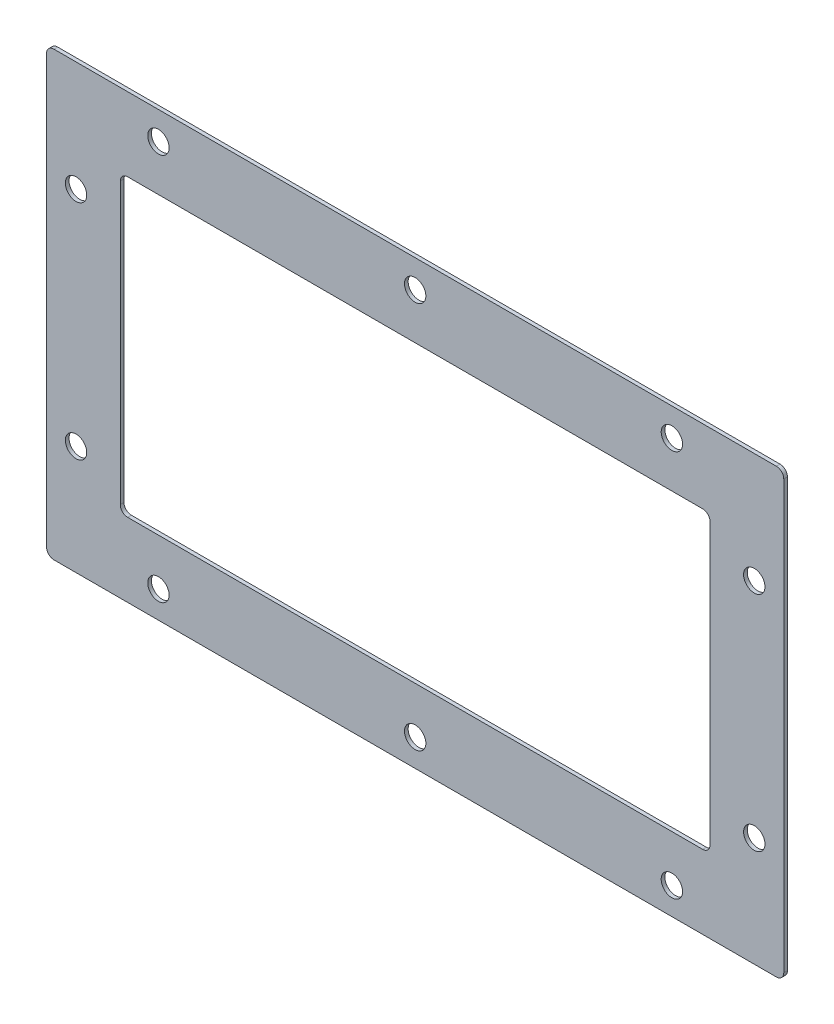
ISO-10303-21;
HEADER;
FILE_DESCRIPTION(('STEP AP214'),'2;1');
FILE_NAME('part.step','',(''),(''),'','','');
FILE_SCHEMA(('AUTOMOTIVE_DESIGN { 1 0 10303 214 1 1 1 1 }'));
ENDSEC;
DATA;
#1=APPLICATION_CONTEXT('core data for automotive mechanical design processes');
#2=APPLICATION_PROTOCOL_DEFINITION('international standard','automotive_design',2000,#1);
#3=PRODUCT_CONTEXT('',#1,'mechanical');
#4=PRODUCT('Part','Part','',(#3));
#5=PRODUCT_RELATED_PRODUCT_CATEGORY('part','',(#4));
#6=PRODUCT_DEFINITION_FORMATION('','',#4);
#7=PRODUCT_DEFINITION_CONTEXT('part definition',#1,'design');
#8=PRODUCT_DEFINITION('design','',#6,#7);
#9=PRODUCT_DEFINITION_SHAPE('','',#8);
#10=(LENGTH_UNIT() NAMED_UNIT(*) SI_UNIT(.MILLI.,.METRE.));
#11=(NAMED_UNIT(*) PLANE_ANGLE_UNIT() SI_UNIT($,.RADIAN.));
#12=(NAMED_UNIT(*) SI_UNIT($,.STERADIAN.) SOLID_ANGLE_UNIT());
#13=UNCERTAINTY_MEASURE_WITH_UNIT(LENGTH_MEASURE(1.E-05),#10,'distance_accuracy_value','');
#14=(GEOMETRIC_REPRESENTATION_CONTEXT(3) GLOBAL_UNCERTAINTY_ASSIGNED_CONTEXT((#13)) GLOBAL_UNIT_ASSIGNED_CONTEXT((#10,
#11,#12)) REPRESENTATION_CONTEXT('',''));
#15=CARTESIAN_POINT('',(0.,0.,0.));
#16=DIRECTION('',(0.,0.,1.));
#17=DIRECTION('',(1.,0.,0.));
#18=AXIS2_PLACEMENT_3D('',#15,#16,#17);
#19=CARTESIAN_POINT('',(0.,0.,1.));
#20=DIRECTION('',(0.,0.,1.));
#21=DIRECTION('',(1.,0.,0.));
#22=AXIS2_PLACEMENT_3D('',#19,#20,#21);
#23=PLANE('',#22);
#24=CARTESIAN_POINT('',(92.0000000000009,-30.3341496229136,1.));
#25=DIRECTION('',(0.,0.,1.));
#26=DIRECTION('',(1.,0.,0.));
#27=AXIS2_PLACEMENT_3D('',#24,#25,#26);
#28=CIRCLE('',#27,2.89999999999997);
#29=CARTESIAN_POINT('',(94.9000000000009,-30.3341496229136,1.));
#30=VERTEX_POINT('',#29);
#31=EDGE_CURVE('E689',#30,#30,#28,.T.);
#32=ORIENTED_EDGE('',*,*,#31,.F.);
#33=EDGE_LOOP('',(#32));
#34=FACE_BOUND('',#33,.T.);
#35=CARTESIAN_POINT('',(69.6464466094077,-52.6627726504688,1.));
#36=DIRECTION('',(0.,0.,1.));
#37=DIRECTION('',(1.,0.,0.));
#38=AXIS2_PLACEMENT_3D('',#35,#36,#37);
#39=CIRCLE('',#38,2.89999999999997);
#40=CARTESIAN_POINT('',(72.5464466094077,-52.6627726504688,1.));
#41=VERTEX_POINT('',#40);
#42=EDGE_CURVE('E683',#41,#41,#39,.T.);
#43=ORIENTED_EDGE('',*,*,#42,.F.);
#44=EDGE_LOOP('',(#43));
#45=FACE_BOUND('',#44,.T.);
#46=CARTESIAN_POINT('',(92.0000000000009,30.107073019041,1.));
#47=DIRECTION('',(0.,0.,1.));
#48=DIRECTION('',(1.,0.,0.));
#49=AXIS2_PLACEMENT_3D('',#46,#47,#48);
#50=CIRCLE('',#49,2.89999999999997);
#51=CARTESIAN_POINT('',(94.9000000000009,30.107073019041,1.));
#52=VERTEX_POINT('',#51);
#53=EDGE_CURVE('E677',#52,#52,#50,.T.);
#54=ORIENTED_EDGE('',*,*,#53,.F.);
#55=EDGE_LOOP('',(#54));
#56=FACE_BOUND('',#55,.T.);
#57=CARTESIAN_POINT('',(9.17142430958626E-13,-52.6627726504688,1.));
#58=DIRECTION('',(0.,0.,1.));
#59=DIRECTION('',(1.,0.,0.));
#60=AXIS2_PLACEMENT_3D('',#57,#58,#59);
#61=CIRCLE('',#60,2.89999999999997);
#62=CARTESIAN_POINT('',(2.90000000000089,-52.6627726504688,1.));
#63=VERTEX_POINT('',#62);
#64=EDGE_CURVE('E671',#63,#63,#61,.T.);
#65=ORIENTED_EDGE('',*,*,#64,.F.);
#66=EDGE_LOOP('',(#65));
#67=FACE_BOUND('',#66,.T.);
#68=CARTESIAN_POINT('',(69.6464466094077,52.4356960465963,1.));
#69=DIRECTION('',(0.,0.,1.));
#70=DIRECTION('',(1.,0.,0.));
#71=AXIS2_PLACEMENT_3D('',#68,#69,#70);
#72=CIRCLE('',#71,2.89999999999997);
#73=CARTESIAN_POINT('',(72.5464466094077,52.4356960465963,1.));
#74=VERTEX_POINT('',#73);
#75=EDGE_CURVE('E665',#74,#74,#72,.T.);
#76=ORIENTED_EDGE('',*,*,#75,.F.);
#77=EDGE_LOOP('',(#76));
#78=FACE_BOUND('',#77,.T.);
#79=CARTESIAN_POINT('',(9.17142430958626E-13,52.4356960465963,1.));
#80=DIRECTION('',(0.,0.,1.));
#81=DIRECTION('',(1.,0.,0.));
#82=AXIS2_PLACEMENT_3D('',#79,#80,#81);
#83=CIRCLE('',#82,2.89999999999997);
#84=CARTESIAN_POINT('',(2.90000000000089,52.4356960465963,1.));
#85=VERTEX_POINT('',#84);
#86=EDGE_CURVE('E659',#85,#85,#83,.T.);
#87=ORIENTED_EDGE('',*,*,#86,.F.);
#88=EDGE_LOOP('',(#87));
#89=FACE_BOUND('',#88,.T.);
#90=CARTESIAN_POINT('',(-69.6464466094058,52.4356960465963,1.));
#91=DIRECTION('',(0.,0.,1.));
#92=DIRECTION('',(1.,0.,0.));
#93=AXIS2_PLACEMENT_3D('',#90,#91,#92);
#94=CIRCLE('',#93,2.89999999999997);
#95=CARTESIAN_POINT('',(-66.7464466094059,52.4356960465963,1.));
#96=VERTEX_POINT('',#95);
#97=EDGE_CURVE('E653',#96,#96,#94,.T.);
#98=ORIENTED_EDGE('',*,*,#97,.F.);
#99=EDGE_LOOP('',(#98));
#100=FACE_BOUND('',#99,.T.);
#101=CARTESIAN_POINT('',(-91.9999999999991,30.107073019041,1.));
#102=DIRECTION('',(0.,0.,1.));
#103=DIRECTION('',(1.,0.,0.));
#104=AXIS2_PLACEMENT_3D('',#101,#102,#103);
#105=CIRCLE('',#104,2.89999999999997);
#106=CARTESIAN_POINT('',(-89.0999999999991,30.107073019041,1.));
#107=VERTEX_POINT('',#106);
#108=EDGE_CURVE('E647',#107,#107,#105,.T.);
#109=ORIENTED_EDGE('',*,*,#108,.F.);
#110=EDGE_LOOP('',(#109));
#111=FACE_BOUND('',#110,.T.);
#112=CARTESIAN_POINT('',(-91.9999999999991,-30.3341496229136,1.));
#113=DIRECTION('',(0.,0.,1.));
#114=DIRECTION('',(1.,0.,0.));
#115=AXIS2_PLACEMENT_3D('',#112,#113,#114);
#116=CIRCLE('',#115,2.89999999999997);
#117=CARTESIAN_POINT('',(-89.0999999999991,-30.3341496229136,1.));
#118=VERTEX_POINT('',#117);
#119=EDGE_CURVE('E641',#118,#118,#116,.T.);
#120=ORIENTED_EDGE('',*,*,#119,.F.);
#121=EDGE_LOOP('',(#120));
#122=FACE_BOUND('',#121,.T.);
#123=CARTESIAN_POINT('',(-69.6464466094058,-52.6627726504688,1.));
#124=DIRECTION('',(0.,0.,1.));
#125=DIRECTION('',(1.,0.,0.));
#126=AXIS2_PLACEMENT_3D('',#123,#124,#125);
#127=CIRCLE('',#126,2.89999999999997);
#128=CARTESIAN_POINT('',(-66.7464466094059,-52.6627726504688,1.));
#129=VERTEX_POINT('',#128);
#130=EDGE_CURVE('E635',#129,#129,#127,.T.);
#131=ORIENTED_EDGE('',*,*,#130,.F.);
#132=EDGE_LOOP('',(#131));
#133=FACE_BOUND('',#132,.T.);
#134=DIRECTION('',(-1.,0.,0.));
#135=VECTOR('',#134,1.);
#136=CARTESIAN_POINT('',(100.,60.,1.));
#137=LINE('',#136,#135);
#138=CARTESIAN_POINT('',(98.,60.,1.));
#139=VERTEX_POINT('',#138);
#140=CARTESIAN_POINT('',(-98.,60.,1.));
#141=VERTEX_POINT('',#140);
#142=EDGE_CURVE('E176',#139,#141,#137,.T.);
#143=ORIENTED_EDGE('',*,*,#142,.T.);
#144=CARTESIAN_POINT('',(-98.,58.,1.));
#145=DIRECTION('',(0.,0.,1.));
#146=DIRECTION('',(1.,0.,0.));
#147=AXIS2_PLACEMENT_3D('',#144,#145,#146);
#148=CIRCLE('',#147,2.);
#149=CARTESIAN_POINT('',(-100.,58.,1.));
#150=VERTEX_POINT('',#149);
#151=EDGE_CURVE('E223',#141,#150,#148,.T.);
#152=ORIENTED_EDGE('',*,*,#151,.T.);
#153=DIRECTION('',(0.,-1.,0.));
#154=VECTOR('',#153,1.);
#155=CARTESIAN_POINT('',(-100.,-60.,1.));
#156=LINE('',#155,#154);
#157=CARTESIAN_POINT('',(-100.,-58.,1.));
#158=VERTEX_POINT('',#157);
#159=EDGE_CURVE('E276',#150,#158,#156,.T.);
#160=ORIENTED_EDGE('',*,*,#159,.T.);
#161=CARTESIAN_POINT('',(-98.,-58.,1.));
#162=DIRECTION('',(0.,0.,1.));
#163=DIRECTION('',(1.,0.,0.));
#164=AXIS2_PLACEMENT_3D('',#161,#162,#163);
#165=CIRCLE('',#164,2.);
#166=CARTESIAN_POINT('',(-98.,-60.,1.));
#167=VERTEX_POINT('',#166);
#168=EDGE_CURVE('E220',#158,#167,#165,.T.);
#169=ORIENTED_EDGE('',*,*,#168,.T.);
#170=DIRECTION('',(1.,0.,0.));
#171=VECTOR('',#170,1.);
#172=CARTESIAN_POINT('',(100.,-60.,1.));
#173=LINE('',#172,#171);
#174=CARTESIAN_POINT('',(98.,-60.,1.));
#175=VERTEX_POINT('',#174);
#176=EDGE_CURVE('E279',#167,#175,#173,.T.);
#177=ORIENTED_EDGE('',*,*,#176,.T.);
#178=CARTESIAN_POINT('',(98.,-58.,1.));
#179=DIRECTION('',(0.,0.,1.));
#180=DIRECTION('',(1.,0.,0.));
#181=AXIS2_PLACEMENT_3D('',#178,#179,#180);
#182=CIRCLE('',#181,2.);
#183=CARTESIAN_POINT('',(100.,-58.,1.));
#184=VERTEX_POINT('',#183);
#185=EDGE_CURVE('E58',#175,#184,#182,.T.);
#186=ORIENTED_EDGE('',*,*,#185,.T.);
#187=DIRECTION('',(0.,1.,0.));
#188=VECTOR('',#187,1.);
#189=CARTESIAN_POINT('',(100.,-60.,1.));
#190=LINE('',#189,#188);
#191=CARTESIAN_POINT('',(100.,58.,1.));
#192=VERTEX_POINT('',#191);
#193=EDGE_CURVE('E181',#184,#192,#190,.T.);
#194=ORIENTED_EDGE('',*,*,#193,.T.);
#195=CARTESIAN_POINT('',(98.,58.,1.));
#196=DIRECTION('',(0.,0.,1.));
#197=DIRECTION('',(1.,0.,0.));
#198=AXIS2_PLACEMENT_3D('',#195,#196,#197);
#199=CIRCLE('',#198,2.);
#200=EDGE_CURVE('E218',#192,#139,#199,.T.);
#201=ORIENTED_EDGE('',*,*,#200,.T.);
#202=EDGE_LOOP('',(#143,#152,#160,#169,#177,#186,#194,#201));
#203=FACE_BOUND('',#202,.T.);
#204=DIRECTION('',(1.,0.,0.));
#205=VECTOR('',#204,1.);
#206=CARTESIAN_POINT('',(80.,-40.,1.));
#207=LINE('',#206,#205);
#208=CARTESIAN_POINT('',(-78.,-40.,1.));
#209=VERTEX_POINT('',#208);
#210=CARTESIAN_POINT('',(78.,-40.,1.));
#211=VERTEX_POINT('',#210);
#212=EDGE_CURVE('E266',#209,#211,#207,.T.);
#213=ORIENTED_EDGE('',*,*,#212,.F.);
#214=CARTESIAN_POINT('',(-78.,-38.,1.));
#215=DIRECTION('',(0.,0.,1.));
#216=DIRECTION('',(1.,0.,0.));
#217=AXIS2_PLACEMENT_3D('',#214,#215,#216);
#218=CIRCLE('',#217,2.);
#219=CARTESIAN_POINT('',(-80.,-38.,1.));
#220=VERTEX_POINT('',#219);
#221=EDGE_CURVE('E161',#209,#220,#218,.F.);
#222=ORIENTED_EDGE('',*,*,#221,.T.);
#223=DIRECTION('',(0.,-1.,0.));
#224=VECTOR('',#223,1.);
#225=CARTESIAN_POINT('',(-80.,-40.,1.));
#226=LINE('',#225,#224);
#227=CARTESIAN_POINT('',(-80.,38.,1.));
#228=VERTEX_POINT('',#227);
#229=EDGE_CURVE('E253',#228,#220,#226,.T.);
#230=ORIENTED_EDGE('',*,*,#229,.F.);
#231=CARTESIAN_POINT('',(-78.,38.,1.));
#232=DIRECTION('',(0.,0.,1.));
#233=DIRECTION('',(1.,0.,0.));
#234=AXIS2_PLACEMENT_3D('',#231,#232,#233);
#235=CIRCLE('',#234,2.);
#236=CARTESIAN_POINT('',(-78.,40.,1.));
#237=VERTEX_POINT('',#236);
#238=EDGE_CURVE('E162',#228,#237,#235,.F.);
#239=ORIENTED_EDGE('',*,*,#238,.T.);
#240=DIRECTION('',(-1.,0.,0.));
#241=VECTOR('',#240,1.);
#242=CARTESIAN_POINT('',(80.,40.,1.));
#243=LINE('',#242,#241);
#244=CARTESIAN_POINT('',(78.,40.,1.));
#245=VERTEX_POINT('',#244);
#246=EDGE_CURVE('E262',#245,#237,#243,.T.);
#247=ORIENTED_EDGE('',*,*,#246,.F.);
#248=CARTESIAN_POINT('',(78.,38.,1.));
#249=DIRECTION('',(0.,0.,1.));
#250=DIRECTION('',(1.,0.,0.));
#251=AXIS2_PLACEMENT_3D('',#248,#249,#250);
#252=CIRCLE('',#251,2.);
#253=CARTESIAN_POINT('',(80.,38.,1.));
#254=VERTEX_POINT('',#253);
#255=EDGE_CURVE('E11',#245,#254,#252,.F.);
#256=ORIENTED_EDGE('',*,*,#255,.T.);
#257=DIRECTION('',(0.,1.,0.));
#258=VECTOR('',#257,1.);
#259=CARTESIAN_POINT('',(80.,-40.,1.));
#260=LINE('',#259,#258);
#261=CARTESIAN_POINT('',(80.,-38.,1.));
#262=VERTEX_POINT('',#261);
#263=EDGE_CURVE('E260',#262,#254,#260,.T.);
#264=ORIENTED_EDGE('',*,*,#263,.F.);
#265=CARTESIAN_POINT('',(78.,-38.,1.));
#266=DIRECTION('',(0.,0.,1.));
#267=DIRECTION('',(1.,0.,0.));
#268=AXIS2_PLACEMENT_3D('',#265,#266,#267);
#269=CIRCLE('',#268,2.);
#270=EDGE_CURVE('E236',#262,#211,#269,.F.);
#271=ORIENTED_EDGE('',*,*,#270,.T.);
#272=EDGE_LOOP('',(#213,#222,#230,#239,#247,#256,#264,#271));
#273=FACE_BOUND('',#272,.T.);
#274=ADVANCED_FACE('F36',(#34,#45,#56,#67,#78,#89,#100,#111,#122,#133,#203,#273),#23,.T.);
#275=CARTESIAN_POINT('',(0.,0.,0.));
#276=DIRECTION('',(0.,0.,1.));
#277=DIRECTION('',(1.,0.,0.));
#278=AXIS2_PLACEMENT_3D('',#275,#276,#277);
#279=PLANE('',#278);
#280=CARTESIAN_POINT('',(92.0000000000009,-30.3341496229136,0.));
#281=DIRECTION('',(0.,0.,1.));
#282=DIRECTION('',(1.,0.,0.));
#283=AXIS2_PLACEMENT_3D('',#280,#281,#282);
#284=CIRCLE('',#283,2.89999999999997);
#285=CARTESIAN_POINT('',(94.9000000000009,-30.3341496229136,0.));
#286=VERTEX_POINT('',#285);
#287=EDGE_CURVE('E686',#286,#286,#284,.T.);
#288=ORIENTED_EDGE('',*,*,#287,.T.);
#289=EDGE_LOOP('',(#288));
#290=FACE_BOUND('',#289,.T.);
#291=CARTESIAN_POINT('',(69.6464466094077,-52.6627726504688,0.));
#292=DIRECTION('',(0.,0.,1.));
#293=DIRECTION('',(1.,0.,0.));
#294=AXIS2_PLACEMENT_3D('',#291,#292,#293);
#295=CIRCLE('',#294,2.89999999999997);
#296=CARTESIAN_POINT('',(72.5464466094077,-52.6627726504688,0.));
#297=VERTEX_POINT('',#296);
#298=EDGE_CURVE('E680',#297,#297,#295,.T.);
#299=ORIENTED_EDGE('',*,*,#298,.T.);
#300=EDGE_LOOP('',(#299));
#301=FACE_BOUND('',#300,.T.);
#302=CARTESIAN_POINT('',(92.0000000000009,30.107073019041,0.));
#303=DIRECTION('',(0.,0.,1.));
#304=DIRECTION('',(1.,0.,0.));
#305=AXIS2_PLACEMENT_3D('',#302,#303,#304);
#306=CIRCLE('',#305,2.89999999999997);
#307=CARTESIAN_POINT('',(94.9000000000009,30.107073019041,0.));
#308=VERTEX_POINT('',#307);
#309=EDGE_CURVE('E674',#308,#308,#306,.T.);
#310=ORIENTED_EDGE('',*,*,#309,.T.);
#311=EDGE_LOOP('',(#310));
#312=FACE_BOUND('',#311,.T.);
#313=CARTESIAN_POINT('',(9.17142430958626E-13,-52.6627726504688,0.));
#314=DIRECTION('',(0.,0.,1.));
#315=DIRECTION('',(1.,0.,0.));
#316=AXIS2_PLACEMENT_3D('',#313,#314,#315);
#317=CIRCLE('',#316,2.89999999999997);
#318=CARTESIAN_POINT('',(2.90000000000089,-52.6627726504688,0.));
#319=VERTEX_POINT('',#318);
#320=EDGE_CURVE('E668',#319,#319,#317,.T.);
#321=ORIENTED_EDGE('',*,*,#320,.T.);
#322=EDGE_LOOP('',(#321));
#323=FACE_BOUND('',#322,.T.);
#324=CARTESIAN_POINT('',(69.6464466094077,52.4356960465963,0.));
#325=DIRECTION('',(0.,0.,1.));
#326=DIRECTION('',(1.,0.,0.));
#327=AXIS2_PLACEMENT_3D('',#324,#325,#326);
#328=CIRCLE('',#327,2.89999999999997);
#329=CARTESIAN_POINT('',(72.5464466094077,52.4356960465963,0.));
#330=VERTEX_POINT('',#329);
#331=EDGE_CURVE('E662',#330,#330,#328,.T.);
#332=ORIENTED_EDGE('',*,*,#331,.T.);
#333=EDGE_LOOP('',(#332));
#334=FACE_BOUND('',#333,.T.);
#335=CARTESIAN_POINT('',(9.17142430958626E-13,52.4356960465963,0.));
#336=DIRECTION('',(0.,0.,1.));
#337=DIRECTION('',(1.,0.,0.));
#338=AXIS2_PLACEMENT_3D('',#335,#336,#337);
#339=CIRCLE('',#338,2.89999999999997);
#340=CARTESIAN_POINT('',(2.90000000000089,52.4356960465963,0.));
#341=VERTEX_POINT('',#340);
#342=EDGE_CURVE('E656',#341,#341,#339,.T.);
#343=ORIENTED_EDGE('',*,*,#342,.T.);
#344=EDGE_LOOP('',(#343));
#345=FACE_BOUND('',#344,.T.);
#346=CARTESIAN_POINT('',(-69.6464466094058,52.4356960465963,0.));
#347=DIRECTION('',(0.,0.,1.));
#348=DIRECTION('',(1.,0.,0.));
#349=AXIS2_PLACEMENT_3D('',#346,#347,#348);
#350=CIRCLE('',#349,2.89999999999997);
#351=CARTESIAN_POINT('',(-66.7464466094059,52.4356960465963,0.));
#352=VERTEX_POINT('',#351);
#353=EDGE_CURVE('E650',#352,#352,#350,.T.);
#354=ORIENTED_EDGE('',*,*,#353,.T.);
#355=EDGE_LOOP('',(#354));
#356=FACE_BOUND('',#355,.T.);
#357=CARTESIAN_POINT('',(-91.9999999999991,30.107073019041,0.));
#358=DIRECTION('',(0.,0.,1.));
#359=DIRECTION('',(1.,0.,0.));
#360=AXIS2_PLACEMENT_3D('',#357,#358,#359);
#361=CIRCLE('',#360,2.89999999999997);
#362=CARTESIAN_POINT('',(-89.0999999999991,30.107073019041,0.));
#363=VERTEX_POINT('',#362);
#364=EDGE_CURVE('E644',#363,#363,#361,.T.);
#365=ORIENTED_EDGE('',*,*,#364,.T.);
#366=EDGE_LOOP('',(#365));
#367=FACE_BOUND('',#366,.T.);
#368=CARTESIAN_POINT('',(-91.9999999999991,-30.3341496229136,0.));
#369=DIRECTION('',(0.,0.,1.));
#370=DIRECTION('',(1.,0.,0.));
#371=AXIS2_PLACEMENT_3D('',#368,#369,#370);
#372=CIRCLE('',#371,2.89999999999997);
#373=CARTESIAN_POINT('',(-89.0999999999991,-30.3341496229136,0.));
#374=VERTEX_POINT('',#373);
#375=EDGE_CURVE('E638',#374,#374,#372,.T.);
#376=ORIENTED_EDGE('',*,*,#375,.T.);
#377=EDGE_LOOP('',(#376));
#378=FACE_BOUND('',#377,.T.);
#379=CARTESIAN_POINT('',(-69.6464466094058,-52.6627726504688,0.));
#380=DIRECTION('',(0.,0.,1.));
#381=DIRECTION('',(1.,0.,0.));
#382=AXIS2_PLACEMENT_3D('',#379,#380,#381);
#383=CIRCLE('',#382,2.89999999999997);
#384=CARTESIAN_POINT('',(-66.7464466094059,-52.6627726504688,0.));
#385=VERTEX_POINT('',#384);
#386=EDGE_CURVE('E273',#385,#385,#383,.T.);
#387=ORIENTED_EDGE('',*,*,#386,.T.);
#388=EDGE_LOOP('',(#387));
#389=FACE_BOUND('',#388,.T.);
#390=DIRECTION('',(0.,-1.,0.));
#391=VECTOR('',#390,1.);
#392=CARTESIAN_POINT('',(-100.,-60.,0.));
#393=LINE('',#392,#391);
#394=CARTESIAN_POINT('',(-100.,58.,0.));
#395=VERTEX_POINT('',#394);
#396=CARTESIAN_POINT('',(-100.,-58.,0.));
#397=VERTEX_POINT('',#396);
#398=EDGE_CURVE('E268',#395,#397,#393,.T.);
#399=ORIENTED_EDGE('',*,*,#398,.F.);
#400=CARTESIAN_POINT('',(-98.,58.,0.));
#401=DIRECTION('',(0.,0.,1.));
#402=DIRECTION('',(1.,0.,0.));
#403=AXIS2_PLACEMENT_3D('',#400,#401,#402);
#404=CIRCLE('',#403,2.);
#405=CARTESIAN_POINT('',(-98.,60.,0.));
#406=VERTEX_POINT('',#405);
#407=EDGE_CURVE('E211',#395,#406,#404,.F.);
#408=ORIENTED_EDGE('',*,*,#407,.T.);
#409=DIRECTION('',(-1.,0.,0.));
#410=VECTOR('',#409,1.);
#411=CARTESIAN_POINT('',(100.,60.,0.));
#412=LINE('',#411,#410);
#413=CARTESIAN_POINT('',(98.,60.,0.));
#414=VERTEX_POINT('',#413);
#415=EDGE_CURVE('E184',#414,#406,#412,.T.);
#416=ORIENTED_EDGE('',*,*,#415,.F.);
#417=CARTESIAN_POINT('',(98.,58.,0.));
#418=DIRECTION('',(0.,0.,1.));
#419=DIRECTION('',(1.,0.,0.));
#420=AXIS2_PLACEMENT_3D('',#417,#418,#419);
#421=CIRCLE('',#420,2.);
#422=CARTESIAN_POINT('',(100.,58.,0.));
#423=VERTEX_POINT('',#422);
#424=EDGE_CURVE('E205',#414,#423,#421,.F.);
#425=ORIENTED_EDGE('',*,*,#424,.T.);
#426=DIRECTION('',(0.,1.,0.));
#427=VECTOR('',#426,1.);
#428=CARTESIAN_POINT('',(100.,-60.,0.));
#429=LINE('',#428,#427);
#430=CARTESIAN_POINT('',(100.,-58.,0.));
#431=VERTEX_POINT('',#430);
#432=EDGE_CURVE('E286',#431,#423,#429,.T.);
#433=ORIENTED_EDGE('',*,*,#432,.F.);
#434=CARTESIAN_POINT('',(98.,-58.,0.));
#435=DIRECTION('',(0.,0.,1.));
#436=DIRECTION('',(1.,0.,0.));
#437=AXIS2_PLACEMENT_3D('',#434,#435,#436);
#438=CIRCLE('',#437,2.);
#439=CARTESIAN_POINT('',(98.,-60.,0.));
#440=VERTEX_POINT('',#439);
#441=EDGE_CURVE('E209',#431,#440,#438,.F.);
#442=ORIENTED_EDGE('',*,*,#441,.T.);
#443=DIRECTION('',(1.,0.,0.));
#444=VECTOR('',#443,1.);
#445=CARTESIAN_POINT('',(100.,-60.,0.));
#446=LINE('',#445,#444);
#447=CARTESIAN_POINT('',(-98.,-60.,0.));
#448=VERTEX_POINT('',#447);
#449=EDGE_CURVE('E284',#448,#440,#446,.T.);
#450=ORIENTED_EDGE('',*,*,#449,.F.);
#451=CARTESIAN_POINT('',(-98.,-58.,0.));
#452=DIRECTION('',(0.,0.,1.));
#453=DIRECTION('',(1.,0.,0.));
#454=AXIS2_PLACEMENT_3D('',#451,#452,#453);
#455=CIRCLE('',#454,2.);
#456=EDGE_CURVE('E207',#448,#397,#455,.F.);
#457=ORIENTED_EDGE('',*,*,#456,.T.);
#458=EDGE_LOOP('',(#399,#408,#416,#425,#433,#442,#450,#457));
#459=FACE_BOUND('',#458,.T.);
#460=DIRECTION('',(-1.,0.,0.));
#461=VECTOR('',#460,1.);
#462=CARTESIAN_POINT('',(80.,40.,0.));
#463=LINE('',#462,#461);
#464=CARTESIAN_POINT('',(78.,40.,0.));
#465=VERTEX_POINT('',#464);
#466=CARTESIAN_POINT('',(-78.,40.,0.));
#467=VERTEX_POINT('',#466);
#468=EDGE_CURVE('E243',#465,#467,#463,.T.);
#469=ORIENTED_EDGE('',*,*,#468,.T.);
#470=CARTESIAN_POINT('',(-78.,38.,0.));
#471=DIRECTION('',(0.,0.,1.));
#472=DIRECTION('',(1.,0.,0.));
#473=AXIS2_PLACEMENT_3D('',#470,#471,#472);
#474=CIRCLE('',#473,2.);
#475=CARTESIAN_POINT('',(-80.,38.,0.));
#476=VERTEX_POINT('',#475);
#477=EDGE_CURVE('E238',#467,#476,#474,.T.);
#478=ORIENTED_EDGE('',*,*,#477,.T.);
#479=DIRECTION('',(0.,-1.,0.));
#480=VECTOR('',#479,1.);
#481=CARTESIAN_POINT('',(-80.,-40.,0.));
#482=LINE('',#481,#480);
#483=CARTESIAN_POINT('',(-80.,-38.,0.));
#484=VERTEX_POINT('',#483);
#485=EDGE_CURVE('E156',#476,#484,#482,.T.);
#486=ORIENTED_EDGE('',*,*,#485,.T.);
#487=CARTESIAN_POINT('',(-78.,-38.,0.));
#488=DIRECTION('',(0.,0.,1.));
#489=DIRECTION('',(1.,0.,0.));
#490=AXIS2_PLACEMENT_3D('',#487,#488,#489);
#491=CIRCLE('',#490,2.);
#492=CARTESIAN_POINT('',(-78.,-40.,0.));
#493=VERTEX_POINT('',#492);
#494=EDGE_CURVE('E150',#484,#493,#491,.T.);
#495=ORIENTED_EDGE('',*,*,#494,.T.);
#496=DIRECTION('',(1.,0.,0.));
#497=VECTOR('',#496,1.);
#498=CARTESIAN_POINT('',(80.,-40.,0.));
#499=LINE('',#498,#497);
#500=CARTESIAN_POINT('',(78.,-40.,0.));
#501=VERTEX_POINT('',#500);
#502=EDGE_CURVE('E154',#493,#501,#499,.T.);
#503=ORIENTED_EDGE('',*,*,#502,.T.);
#504=CARTESIAN_POINT('',(78.,-38.,0.));
#505=DIRECTION('',(0.,0.,1.));
#506=DIRECTION('',(1.,0.,0.));
#507=AXIS2_PLACEMENT_3D('',#504,#505,#506);
#508=CIRCLE('',#507,2.);
#509=CARTESIAN_POINT('',(80.,-38.,0.));
#510=VERTEX_POINT('',#509);
#511=EDGE_CURVE('E234',#501,#510,#508,.T.);
#512=ORIENTED_EDGE('',*,*,#511,.T.);
#513=DIRECTION('',(0.,1.,0.));
#514=VECTOR('',#513,1.);
#515=CARTESIAN_POINT('',(80.,-40.,0.));
#516=LINE('',#515,#514);
#517=CARTESIAN_POINT('',(80.,38.,0.));
#518=VERTEX_POINT('',#517);
#519=EDGE_CURVE('E172',#510,#518,#516,.T.);
#520=ORIENTED_EDGE('',*,*,#519,.T.);
#521=CARTESIAN_POINT('',(78.,38.,0.));
#522=DIRECTION('',(0.,0.,1.));
#523=DIRECTION('',(1.,0.,0.));
#524=AXIS2_PLACEMENT_3D('',#521,#522,#523);
#525=CIRCLE('',#524,2.);
#526=EDGE_CURVE('E44',#518,#465,#525,.T.);
#527=ORIENTED_EDGE('',*,*,#526,.T.);
#528=EDGE_LOOP('',(#469,#478,#486,#495,#503,#512,#520,#527));
#529=FACE_BOUND('',#528,.T.);
#530=ADVANCED_FACE('F153',(#290,#301,#312,#323,#334,#345,#356,#367,#378,#389,#459,#529),#279,.F.);
#531=CARTESIAN_POINT('',(-100.,-60.,1.));
#532=DIRECTION('',(1.,0.,0.));
#533=DIRECTION('',(0.,1.,0.));
#534=AXIS2_PLACEMENT_3D('',#531,#532,#533);
#535=PLANE('',#534);
#536=ORIENTED_EDGE('',*,*,#159,.F.);
#537=DIRECTION('',(0.,0.,-1.));
#538=VECTOR('',#537,1.);
#539=CARTESIAN_POINT('',(-100.,58.,1.));
#540=LINE('',#539,#538);
#541=EDGE_CURVE('E202',#150,#395,#540,.T.);
#542=ORIENTED_EDGE('',*,*,#541,.T.);
#543=ORIENTED_EDGE('',*,*,#398,.T.);
#544=DIRECTION('',(0.,0.,-1.));
#545=VECTOR('',#544,1.);
#546=CARTESIAN_POINT('',(-100.,-58.,1.));
#547=LINE('',#546,#545);
#548=EDGE_CURVE('E200',#397,#158,#547,.F.);
#549=ORIENTED_EDGE('',*,*,#548,.T.);
#550=EDGE_LOOP('',(#536,#542,#543,#549));
#551=FACE_BOUND('',#550,.T.);
#552=ADVANCED_FACE('F303',(#551),#535,.F.);
#553=CARTESIAN_POINT('',(100.,-60.,1.));
#554=DIRECTION('',(0.,1.,0.));
#555=DIRECTION('',(-1.,0.,0.));
#556=AXIS2_PLACEMENT_3D('',#553,#554,#555);
#557=PLANE('',#556);
#558=ORIENTED_EDGE('',*,*,#449,.T.);
#559=DIRECTION('',(0.,0.,-1.));
#560=VECTOR('',#559,1.);
#561=CARTESIAN_POINT('',(98.,-60.,1.));
#562=LINE('',#561,#560);
#563=EDGE_CURVE('E232',#440,#175,#562,.F.);
#564=ORIENTED_EDGE('',*,*,#563,.T.);
#565=ORIENTED_EDGE('',*,*,#176,.F.);
#566=DIRECTION('',(0.,0.,-1.));
#567=VECTOR('',#566,1.);
#568=CARTESIAN_POINT('',(-98.,-60.,1.));
#569=LINE('',#568,#567);
#570=EDGE_CURVE('E229',#167,#448,#569,.T.);
#571=ORIENTED_EDGE('',*,*,#570,.T.);
#572=EDGE_LOOP('',(#558,#564,#565,#571));
#573=FACE_BOUND('',#572,.T.);
#574=ADVANCED_FACE('F311',(#573),#557,.F.);
#575=CARTESIAN_POINT('',(100.,-60.,1.));
#576=DIRECTION('',(-1.,0.,0.));
#577=DIRECTION('',(0.,0.,1.));
#578=AXIS2_PLACEMENT_3D('',#575,#576,#577);
#579=PLANE('',#578);
#580=ORIENTED_EDGE('',*,*,#193,.F.);
#581=DIRECTION('',(0.,0.,-1.));
#582=VECTOR('',#581,1.);
#583=CARTESIAN_POINT('',(100.,-58.,1.));
#584=LINE('',#583,#582);
#585=EDGE_CURVE('E226',#184,#431,#584,.T.);
#586=ORIENTED_EDGE('',*,*,#585,.T.);
#587=ORIENTED_EDGE('',*,*,#432,.T.);
#588=DIRECTION('',(0.,0.,-1.));
#589=VECTOR('',#588,1.);
#590=CARTESIAN_POINT('',(100.,58.,1.));
#591=LINE('',#590,#589);
#592=EDGE_CURVE('E51',#423,#192,#591,.F.);
#593=ORIENTED_EDGE('',*,*,#592,.T.);
#594=EDGE_LOOP('',(#580,#586,#587,#593));
#595=FACE_BOUND('',#594,.T.);
#596=ADVANCED_FACE('F317',(#595),#579,.F.);
#597=CARTESIAN_POINT('',(100.,60.,1.));
#598=DIRECTION('',(0.,-1.,0.));
#599=DIRECTION('',(1.,0.,0.));
#600=AXIS2_PLACEMENT_3D('',#597,#598,#599);
#601=PLANE('',#600);
#602=ORIENTED_EDGE('',*,*,#415,.T.);
#603=DIRECTION('',(0.,0.,-1.));
#604=VECTOR('',#603,1.);
#605=CARTESIAN_POINT('',(-98.,60.,1.));
#606=LINE('',#605,#604);
#607=EDGE_CURVE('E216',#406,#141,#606,.F.);
#608=ORIENTED_EDGE('',*,*,#607,.T.);
#609=ORIENTED_EDGE('',*,*,#142,.F.);
#610=DIRECTION('',(0.,0.,-1.));
#611=VECTOR('',#610,1.);
#612=CARTESIAN_POINT('',(98.,60.,1.));
#613=LINE('',#612,#611);
#614=EDGE_CURVE('E213',#139,#414,#613,.T.);
#615=ORIENTED_EDGE('',*,*,#614,.T.);
#616=EDGE_LOOP('',(#602,#608,#609,#615));
#617=FACE_BOUND('',#616,.T.);
#618=ADVANCED_FACE('F292',(#617),#601,.F.);
#619=CARTESIAN_POINT('',(-80.,-40.,1.));
#620=DIRECTION('',(1.,0.,0.));
#621=DIRECTION('',(0.,0.,-1.));
#622=AXIS2_PLACEMENT_3D('',#619,#620,#621);
#623=PLANE('',#622);
#624=ORIENTED_EDGE('',*,*,#485,.F.);
#625=DIRECTION('',(0.,0.,-1.));
#626=VECTOR('',#625,1.);
#627=CARTESIAN_POINT('',(-80.,38.,1.));
#628=LINE('',#627,#626);
#629=EDGE_CURVE('E198',#476,#228,#628,.F.);
#630=ORIENTED_EDGE('',*,*,#629,.T.);
#631=ORIENTED_EDGE('',*,*,#229,.T.);
#632=DIRECTION('',(0.,0.,-1.));
#633=VECTOR('',#632,1.);
#634=CARTESIAN_POINT('',(-80.,-38.,0.));
#635=LINE('',#634,#633);
#636=EDGE_CURVE('E196',#220,#484,#635,.T.);
#637=ORIENTED_EDGE('',*,*,#636,.T.);
#638=EDGE_LOOP('',(#624,#630,#631,#637));
#639=FACE_BOUND('',#638,.T.);
#640=ADVANCED_FACE('F340',(#639),#623,.T.);
#641=CARTESIAN_POINT('',(80.,-40.,1.));
#642=DIRECTION('',(0.,1.,0.));
#643=DIRECTION('',(0.,0.,1.));
#644=AXIS2_PLACEMENT_3D('',#641,#642,#643);
#645=PLANE('',#644);
#646=ORIENTED_EDGE('',*,*,#212,.T.);
#647=DIRECTION('',(0.,0.,-1.));
#648=VECTOR('',#647,1.);
#649=CARTESIAN_POINT('',(78.,-40.,0.));
#650=LINE('',#649,#648);
#651=EDGE_CURVE('E171',#211,#501,#650,.T.);
#652=ORIENTED_EDGE('',*,*,#651,.T.);
#653=ORIENTED_EDGE('',*,*,#502,.F.);
#654=DIRECTION('',(0.,0.,-1.));
#655=VECTOR('',#654,1.);
#656=CARTESIAN_POINT('',(-78.,-40.,1.));
#657=LINE('',#656,#655);
#658=EDGE_CURVE('E168',#493,#209,#657,.F.);
#659=ORIENTED_EDGE('',*,*,#658,.T.);
#660=EDGE_LOOP('',(#646,#652,#653,#659));
#661=FACE_BOUND('',#660,.T.);
#662=ADVANCED_FACE('F167',(#661),#645,.T.);
#663=CARTESIAN_POINT('',(80.,-40.,1.));
#664=DIRECTION('',(-1.,0.,0.));
#665=DIRECTION('',(0.,0.,1.));
#666=AXIS2_PLACEMENT_3D('',#663,#664,#665);
#667=PLANE('',#666);
#668=ORIENTED_EDGE('',*,*,#519,.F.);
#669=DIRECTION('',(0.,0.,-1.));
#670=VECTOR('',#669,1.);
#671=CARTESIAN_POINT('',(80.,-38.,1.));
#672=LINE('',#671,#670);
#673=EDGE_CURVE('E189',#510,#262,#672,.F.);
#674=ORIENTED_EDGE('',*,*,#673,.T.);
#675=ORIENTED_EDGE('',*,*,#263,.T.);
#676=DIRECTION('',(0.,0.,-1.));
#677=VECTOR('',#676,1.);
#678=CARTESIAN_POINT('',(80.,38.,0.));
#679=LINE('',#678,#677);
#680=EDGE_CURVE('E178',#254,#518,#679,.T.);
#681=ORIENTED_EDGE('',*,*,#680,.T.);
#682=EDGE_LOOP('',(#668,#674,#675,#681));
#683=FACE_BOUND('',#682,.T.);
#684=ADVANCED_FACE('F264',(#683),#667,.T.);
#685=CARTESIAN_POINT('',(80.,40.,1.));
#686=DIRECTION('',(0.,-1.,0.));
#687=DIRECTION('',(1.,0.,0.));
#688=AXIS2_PLACEMENT_3D('',#685,#686,#687);
#689=PLANE('',#688);
#690=ORIENTED_EDGE('',*,*,#246,.T.);
#691=DIRECTION('',(0.,0.,-1.));
#692=VECTOR('',#691,1.);
#693=CARTESIAN_POINT('',(-78.,40.,0.));
#694=LINE('',#693,#692);
#695=EDGE_CURVE('E193',#237,#467,#694,.T.);
#696=ORIENTED_EDGE('',*,*,#695,.T.);
#697=ORIENTED_EDGE('',*,*,#468,.F.);
#698=DIRECTION('',(0.,0.,-1.));
#699=VECTOR('',#698,1.);
#700=CARTESIAN_POINT('',(78.,40.,1.));
#701=LINE('',#700,#699);
#702=EDGE_CURVE('E191',#465,#245,#701,.F.);
#703=ORIENTED_EDGE('',*,*,#702,.T.);
#704=EDGE_LOOP('',(#690,#696,#697,#703));
#705=FACE_BOUND('',#704,.T.);
#706=ADVANCED_FACE('F250',(#705),#689,.T.);
#707=CARTESIAN_POINT('',(78.,-38.,1.));
#708=DIRECTION('',(0.,0.,1.));
#709=DIRECTION('',(1.,0.,0.));
#710=AXIS2_PLACEMENT_3D('',#707,#708,#709);
#711=CYLINDRICAL_SURFACE('',#710,2.);
#712=ORIENTED_EDGE('',*,*,#270,.F.);
#713=ORIENTED_EDGE('',*,*,#673,.F.);
#714=ORIENTED_EDGE('',*,*,#511,.F.);
#715=ORIENTED_EDGE('',*,*,#651,.F.);
#716=EDGE_LOOP('',(#712,#713,#714,#715));
#717=FACE_BOUND('',#716,.T.);
#718=ADVANCED_FACE('F351',(#717),#711,.F.);
#719=CARTESIAN_POINT('',(-78.,38.,1.));
#720=DIRECTION('',(0.,0.,1.));
#721=DIRECTION('',(1.,0.,0.));
#722=AXIS2_PLACEMENT_3D('',#719,#720,#721);
#723=CYLINDRICAL_SURFACE('',#722,2.);
#724=ORIENTED_EDGE('',*,*,#238,.F.);
#725=ORIENTED_EDGE('',*,*,#629,.F.);
#726=ORIENTED_EDGE('',*,*,#477,.F.);
#727=ORIENTED_EDGE('',*,*,#695,.F.);
#728=EDGE_LOOP('',(#724,#725,#726,#727));
#729=FACE_BOUND('',#728,.T.);
#730=ADVANCED_FACE('F354',(#729),#723,.F.);
#731=CARTESIAN_POINT('',(-78.,-38.,1.));
#732=DIRECTION('',(0.,0.,1.));
#733=DIRECTION('',(1.,0.,0.));
#734=AXIS2_PLACEMENT_3D('',#731,#732,#733);
#735=CYLINDRICAL_SURFACE('',#734,2.);
#736=ORIENTED_EDGE('',*,*,#221,.F.);
#737=ORIENTED_EDGE('',*,*,#658,.F.);
#738=ORIENTED_EDGE('',*,*,#494,.F.);
#739=ORIENTED_EDGE('',*,*,#636,.F.);
#740=EDGE_LOOP('',(#736,#737,#738,#739));
#741=FACE_BOUND('',#740,.T.);
#742=ADVANCED_FACE('F175',(#741),#735,.F.);
#743=CARTESIAN_POINT('',(78.,38.,1.));
#744=DIRECTION('',(0.,0.,1.));
#745=DIRECTION('',(1.,0.,0.));
#746=AXIS2_PLACEMENT_3D('',#743,#744,#745);
#747=CYLINDRICAL_SURFACE('',#746,2.);
#748=ORIENTED_EDGE('',*,*,#255,.F.);
#749=ORIENTED_EDGE('',*,*,#702,.F.);
#750=ORIENTED_EDGE('',*,*,#526,.F.);
#751=ORIENTED_EDGE('',*,*,#680,.F.);
#752=EDGE_LOOP('',(#748,#749,#750,#751));
#753=FACE_BOUND('',#752,.T.);
#754=ADVANCED_FACE('F256',(#753),#747,.F.);
#755=CARTESIAN_POINT('',(-98.,58.,1.));
#756=DIRECTION('',(0.,0.,-1.));
#757=DIRECTION('',(-1.,0.,0.));
#758=AXIS2_PLACEMENT_3D('',#755,#756,#757);
#759=CYLINDRICAL_SURFACE('',#758,2.);
#760=ORIENTED_EDGE('',*,*,#151,.F.);
#761=ORIENTED_EDGE('',*,*,#607,.F.);
#762=ORIENTED_EDGE('',*,*,#407,.F.);
#763=ORIENTED_EDGE('',*,*,#541,.F.);
#764=EDGE_LOOP('',(#760,#761,#762,#763));
#765=FACE_BOUND('',#764,.T.);
#766=ADVANCED_FACE('F298',(#765),#759,.T.);
#767=CARTESIAN_POINT('',(98.,-58.,1.));
#768=DIRECTION('',(0.,0.,-1.));
#769=DIRECTION('',(-1.,0.,0.));
#770=AXIS2_PLACEMENT_3D('',#767,#768,#769);
#771=CYLINDRICAL_SURFACE('',#770,2.);
#772=ORIENTED_EDGE('',*,*,#185,.F.);
#773=ORIENTED_EDGE('',*,*,#563,.F.);
#774=ORIENTED_EDGE('',*,*,#441,.F.);
#775=ORIENTED_EDGE('',*,*,#585,.F.);
#776=EDGE_LOOP('',(#772,#773,#774,#775));
#777=FACE_BOUND('',#776,.T.);
#778=ADVANCED_FACE('F315',(#777),#771,.T.);
#779=CARTESIAN_POINT('',(-98.,-58.,1.));
#780=DIRECTION('',(0.,0.,-1.));
#781=DIRECTION('',(-1.,0.,0.));
#782=AXIS2_PLACEMENT_3D('',#779,#780,#781);
#783=CYLINDRICAL_SURFACE('',#782,2.);
#784=ORIENTED_EDGE('',*,*,#168,.F.);
#785=ORIENTED_EDGE('',*,*,#548,.F.);
#786=ORIENTED_EDGE('',*,*,#456,.F.);
#787=ORIENTED_EDGE('',*,*,#570,.F.);
#788=EDGE_LOOP('',(#784,#785,#786,#787));
#789=FACE_BOUND('',#788,.T.);
#790=ADVANCED_FACE('F307',(#789),#783,.T.);
#791=CARTESIAN_POINT('',(98.,58.,1.));
#792=DIRECTION('',(0.,0.,-1.));
#793=DIRECTION('',(-1.,0.,0.));
#794=AXIS2_PLACEMENT_3D('',#791,#792,#793);
#795=CYLINDRICAL_SURFACE('',#794,2.);
#796=ORIENTED_EDGE('',*,*,#200,.F.);
#797=ORIENTED_EDGE('',*,*,#592,.F.);
#798=ORIENTED_EDGE('',*,*,#424,.F.);
#799=ORIENTED_EDGE('',*,*,#614,.F.);
#800=EDGE_LOOP('',(#796,#797,#798,#799));
#801=FACE_BOUND('',#800,.T.);
#802=ADVANCED_FACE('F38',(#801),#795,.T.);
#803=CARTESIAN_POINT('',(-69.6464466094058,-52.6627726504688,1.));
#804=DIRECTION('',(0.,0.,1.));
#805=DIRECTION('',(1.,0.,0.));
#806=AXIS2_PLACEMENT_3D('',#803,#804,#805);
#807=CYLINDRICAL_SURFACE('',#806,2.89999999999997);
#808=ORIENTED_EDGE('',*,*,#386,.F.);
#809=EDGE_LOOP('',(#808));
#810=FACE_BOUND('',#809,.T.);
#811=ORIENTED_EDGE('',*,*,#130,.T.);
#812=EDGE_LOOP('',(#811));
#813=FACE_BOUND('',#812,.T.);
#814=ADVANCED_FACE('F321',(#810,#813),#807,.F.);
#815=CARTESIAN_POINT('',(-91.9999999999991,-30.3341496229136,1.));
#816=DIRECTION('',(0.,0.,1.));
#817=DIRECTION('',(1.,0.,0.));
#818=AXIS2_PLACEMENT_3D('',#815,#816,#817);
#819=CYLINDRICAL_SURFACE('',#818,2.89999999999997);
#820=ORIENTED_EDGE('',*,*,#375,.F.);
#821=EDGE_LOOP('',(#820));
#822=FACE_BOUND('',#821,.T.);
#823=ORIENTED_EDGE('',*,*,#119,.T.);
#824=EDGE_LOOP('',(#823));
#825=FACE_BOUND('',#824,.T.);
#826=ADVANCED_FACE('F326',(#822,#825),#819,.F.);
#827=CARTESIAN_POINT('',(-91.9999999999991,30.107073019041,1.));
#828=DIRECTION('',(0.,0.,1.));
#829=DIRECTION('',(1.,0.,0.));
#830=AXIS2_PLACEMENT_3D('',#827,#828,#829);
#831=CYLINDRICAL_SURFACE('',#830,2.89999999999997);
#832=ORIENTED_EDGE('',*,*,#364,.F.);
#833=EDGE_LOOP('',(#832));
#834=FACE_BOUND('',#833,.T.);
#835=ORIENTED_EDGE('',*,*,#108,.T.);
#836=EDGE_LOOP('',(#835));
#837=FACE_BOUND('',#836,.T.);
#838=ADVANCED_FACE('F395',(#834,#837),#831,.F.);
#839=CARTESIAN_POINT('',(-69.6464466094058,52.4356960465963,1.));
#840=DIRECTION('',(0.,0.,1.));
#841=DIRECTION('',(1.,0.,0.));
#842=AXIS2_PLACEMENT_3D('',#839,#840,#841);
#843=CYLINDRICAL_SURFACE('',#842,2.89999999999997);
#844=ORIENTED_EDGE('',*,*,#353,.F.);
#845=EDGE_LOOP('',(#844));
#846=FACE_BOUND('',#845,.T.);
#847=ORIENTED_EDGE('',*,*,#97,.T.);
#848=EDGE_LOOP('',(#847));
#849=FACE_BOUND('',#848,.T.);
#850=ADVANCED_FACE('F405',(#846,#849),#843,.F.);
#851=CARTESIAN_POINT('',(9.17142430958626E-13,52.4356960465963,1.));
#852=DIRECTION('',(0.,0.,1.));
#853=DIRECTION('',(1.,0.,0.));
#854=AXIS2_PLACEMENT_3D('',#851,#852,#853);
#855=CYLINDRICAL_SURFACE('',#854,2.89999999999997);
#856=ORIENTED_EDGE('',*,*,#342,.F.);
#857=EDGE_LOOP('',(#856));
#858=FACE_BOUND('',#857,.T.);
#859=ORIENTED_EDGE('',*,*,#86,.T.);
#860=EDGE_LOOP('',(#859));
#861=FACE_BOUND('',#860,.T.);
#862=ADVANCED_FACE('F415',(#858,#861),#855,.F.);
#863=CARTESIAN_POINT('',(69.6464466094077,52.4356960465963,1.));
#864=DIRECTION('',(0.,0.,1.));
#865=DIRECTION('',(1.,0.,0.));
#866=AXIS2_PLACEMENT_3D('',#863,#864,#865);
#867=CYLINDRICAL_SURFACE('',#866,2.89999999999997);
#868=ORIENTED_EDGE('',*,*,#331,.F.);
#869=EDGE_LOOP('',(#868));
#870=FACE_BOUND('',#869,.T.);
#871=ORIENTED_EDGE('',*,*,#75,.T.);
#872=EDGE_LOOP('',(#871));
#873=FACE_BOUND('',#872,.T.);
#874=ADVANCED_FACE('F425',(#870,#873),#867,.F.);
#875=CARTESIAN_POINT('',(9.17142430958626E-13,-52.6627726504688,1.));
#876=DIRECTION('',(0.,0.,1.));
#877=DIRECTION('',(1.,0.,0.));
#878=AXIS2_PLACEMENT_3D('',#875,#876,#877);
#879=CYLINDRICAL_SURFACE('',#878,2.89999999999997);
#880=ORIENTED_EDGE('',*,*,#320,.F.);
#881=EDGE_LOOP('',(#880));
#882=FACE_BOUND('',#881,.T.);
#883=ORIENTED_EDGE('',*,*,#64,.T.);
#884=EDGE_LOOP('',(#883));
#885=FACE_BOUND('',#884,.T.);
#886=ADVANCED_FACE('F435',(#882,#885),#879,.F.);
#887=CARTESIAN_POINT('',(92.0000000000009,30.107073019041,1.));
#888=DIRECTION('',(0.,0.,1.));
#889=DIRECTION('',(1.,0.,0.));
#890=AXIS2_PLACEMENT_3D('',#887,#888,#889);
#891=CYLINDRICAL_SURFACE('',#890,2.89999999999997);
#892=ORIENTED_EDGE('',*,*,#309,.F.);
#893=EDGE_LOOP('',(#892));
#894=FACE_BOUND('',#893,.T.);
#895=ORIENTED_EDGE('',*,*,#53,.T.);
#896=EDGE_LOOP('',(#895));
#897=FACE_BOUND('',#896,.T.);
#898=ADVANCED_FACE('F445',(#894,#897),#891,.F.);
#899=CARTESIAN_POINT('',(69.6464466094077,-52.6627726504688,1.));
#900=DIRECTION('',(0.,0.,1.));
#901=DIRECTION('',(1.,0.,0.));
#902=AXIS2_PLACEMENT_3D('',#899,#900,#901);
#903=CYLINDRICAL_SURFACE('',#902,2.89999999999997);
#904=ORIENTED_EDGE('',*,*,#298,.F.);
#905=EDGE_LOOP('',(#904));
#906=FACE_BOUND('',#905,.T.);
#907=ORIENTED_EDGE('',*,*,#42,.T.);
#908=EDGE_LOOP('',(#907));
#909=FACE_BOUND('',#908,.T.);
#910=ADVANCED_FACE('F455',(#906,#909),#903,.F.);
#911=CARTESIAN_POINT('',(92.0000000000009,-30.3341496229136,1.));
#912=DIRECTION('',(0.,0.,1.));
#913=DIRECTION('',(1.,0.,0.));
#914=AXIS2_PLACEMENT_3D('',#911,#912,#913);
#915=CYLINDRICAL_SURFACE('',#914,2.89999999999997);
#916=ORIENTED_EDGE('',*,*,#287,.F.);
#917=EDGE_LOOP('',(#916));
#918=FACE_BOUND('',#917,.T.);
#919=ORIENTED_EDGE('',*,*,#31,.T.);
#920=EDGE_LOOP('',(#919));
#921=FACE_BOUND('',#920,.T.);
#922=ADVANCED_FACE('F465',(#918,#921),#915,.F.);
#923=CLOSED_SHELL('',(#274,#530,#552,#574,#596,#618,#640,#662,#684,#706,#718,#730,#742,#754,
#766,#778,#790,#802,#814,#826,#838,#850,#862,#874,#886,#898,#910,#922));
#924=MANIFOLD_SOLID_BREP('B2',#923);
#925=ADVANCED_BREP_SHAPE_REPRESENTATION('',(#18,#924),#14);
#926=SHAPE_DEFINITION_REPRESENTATION(#9,#925);
ENDSEC;
END-ISO-10303-21;
